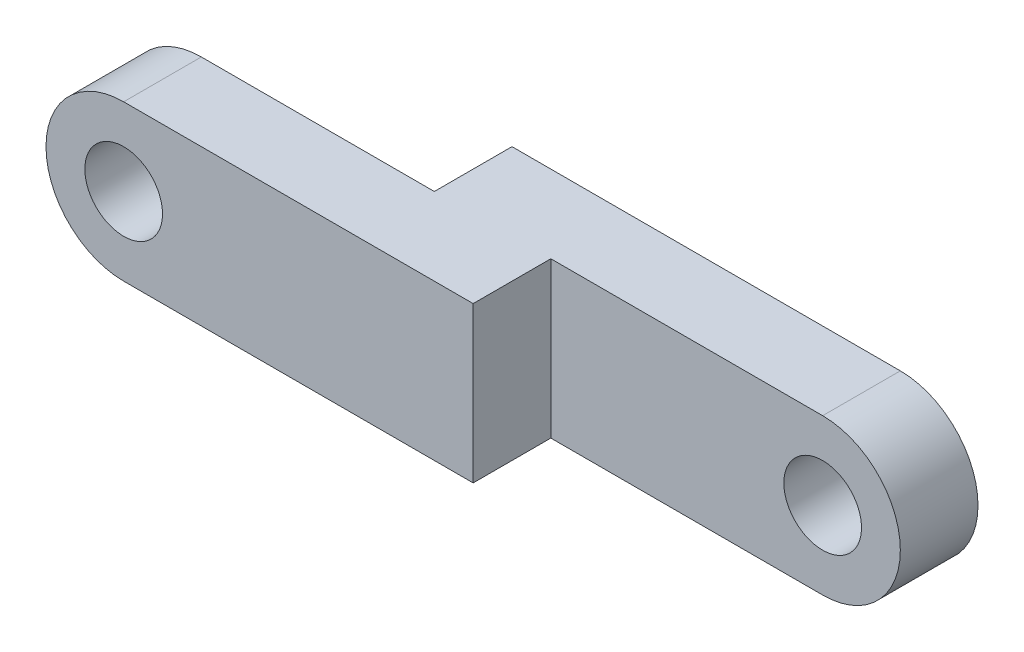
ISO-10303-21;
HEADER;
FILE_DESCRIPTION(('STEP AP214'),'2;1');
FILE_NAME('part.step','',(''),(''),'','','');
FILE_SCHEMA(('AUTOMOTIVE_DESIGN { 1 0 10303 214 1 1 1 1 }'));
ENDSEC;
DATA;
#1=APPLICATION_CONTEXT('core data for automotive mechanical design processes');
#2=APPLICATION_PROTOCOL_DEFINITION('international standard','automotive_design',2000,#1);
#3=PRODUCT_CONTEXT('',#1,'mechanical');
#4=PRODUCT('Part','Part','',(#3));
#5=PRODUCT_RELATED_PRODUCT_CATEGORY('part','',(#4));
#6=PRODUCT_DEFINITION_FORMATION('','',#4);
#7=PRODUCT_DEFINITION_CONTEXT('part definition',#1,'design');
#8=PRODUCT_DEFINITION('design','',#6,#7);
#9=PRODUCT_DEFINITION_SHAPE('','',#8);
#10=(LENGTH_UNIT() NAMED_UNIT(*) SI_UNIT(.MILLI.,.METRE.));
#11=(NAMED_UNIT(*) PLANE_ANGLE_UNIT() SI_UNIT($,.RADIAN.));
#12=(NAMED_UNIT(*) SI_UNIT($,.STERADIAN.) SOLID_ANGLE_UNIT());
#13=UNCERTAINTY_MEASURE_WITH_UNIT(LENGTH_MEASURE(1.E-05),#10,'distance_accuracy_value','');
#14=(GEOMETRIC_REPRESENTATION_CONTEXT(3) GLOBAL_UNCERTAINTY_ASSIGNED_CONTEXT((#13)) GLOBAL_UNIT_ASSIGNED_CONTEXT((#10,
#11,#12)) REPRESENTATION_CONTEXT('',''));
#15=CARTESIAN_POINT('',(0.,0.,0.));
#16=DIRECTION('',(0.,0.,1.));
#17=DIRECTION('',(1.,0.,0.));
#18=AXIS2_PLACEMENT_3D('',#15,#16,#17);
#19=CARTESIAN_POINT('',(-10.16,0.,-1.27));
#20=DIRECTION('',(0.,0.,1.));
#21=DIRECTION('',(1.,0.,0.));
#22=AXIS2_PLACEMENT_3D('',#19,#20,#21);
#23=CYLINDRICAL_SURFACE('',#22,2.54000000000001);
#24=DIRECTION('',(0.,0.,1.));
#25=VECTOR('',#24,1.);
#26=CARTESIAN_POINT('',(-10.16,-2.54000000000001,-1.27));
#27=LINE('',#26,#25);
#28=CARTESIAN_POINT('',(-10.16,-2.54000000000001,-1.27));
#29=VERTEX_POINT('',#28);
#30=CARTESIAN_POINT('',(-10.16,-2.54000000000001,1.27));
#31=VERTEX_POINT('',#30);
#32=EDGE_CURVE('E183',#29,#31,#27,.T.);
#33=ORIENTED_EDGE('',*,*,#32,.T.);
#34=CARTESIAN_POINT('',(-10.16,0.,1.27));
#35=DIRECTION('',(0.,0.,1.));
#36=DIRECTION('',(1.,0.,0.));
#37=AXIS2_PLACEMENT_3D('',#34,#35,#36);
#38=CIRCLE('',#37,2.54000000000001);
#39=CARTESIAN_POINT('',(-10.16,2.54000000000001,1.27));
#40=VERTEX_POINT('',#39);
#41=EDGE_CURVE('E160',#40,#31,#38,.T.);
#42=ORIENTED_EDGE('',*,*,#41,.F.);
#43=DIRECTION('',(0.,0.,1.));
#44=VECTOR('',#43,1.);
#45=CARTESIAN_POINT('',(-10.16,2.54000000000001,-1.27));
#46=LINE('',#45,#44);
#47=CARTESIAN_POINT('',(-10.16,2.54000000000001,-1.27));
#48=VERTEX_POINT('',#47);
#49=EDGE_CURVE('E45',#48,#40,#46,.T.);
#50=ORIENTED_EDGE('',*,*,#49,.F.);
#51=CARTESIAN_POINT('',(-10.16,0.,-1.27));
#52=DIRECTION('',(0.,0.,1.));
#53=DIRECTION('',(1.,0.,0.));
#54=AXIS2_PLACEMENT_3D('',#51,#52,#53);
#55=CIRCLE('',#54,2.54000000000001);
#56=EDGE_CURVE('E174',#48,#29,#55,.T.);
#57=ORIENTED_EDGE('',*,*,#56,.T.);
#58=EDGE_LOOP('',(#33,#42,#50,#57));
#59=FACE_BOUND('',#58,.T.);
#60=ADVANCED_FACE('F37',(#59),#23,.T.);
#61=CARTESIAN_POINT('',(-10.16,2.54000000000001,-1.27));
#62=DIRECTION('',(0.,1.,0.));
#63=DIRECTION('',(-1.,0.,0.));
#64=AXIS2_PLACEMENT_3D('',#61,#62,#63);
#65=PLANE('',#64);
#66=DIRECTION('',(-1.,0.,0.));
#67=VECTOR('',#66,1.);
#68=CARTESIAN_POINT('',(1.27,2.54000000000001,-1.27));
#69=LINE('',#68,#67);
#70=CARTESIAN_POINT('',(10.16,2.54000000000001,-1.27));
#71=VERTEX_POINT('',#70);
#72=CARTESIAN_POINT('',(1.27,2.54000000000001,-1.27));
#73=VERTEX_POINT('',#72);
#74=EDGE_CURVE('E111',#71,#73,#69,.T.);
#75=ORIENTED_EDGE('',*,*,#74,.F.);
#76=DIRECTION('',(0.,0.,1.));
#77=VECTOR('',#76,1.);
#78=CARTESIAN_POINT('',(10.16,2.54000000000001,-1.27));
#79=LINE('',#78,#77);
#80=CARTESIAN_POINT('',(10.16,2.54000000000001,-3.81));
#81=VERTEX_POINT('',#80);
#82=EDGE_CURVE('E187',#81,#71,#79,.T.);
#83=ORIENTED_EDGE('',*,*,#82,.F.);
#84=DIRECTION('',(1.,0.,0.));
#85=VECTOR('',#84,1.);
#86=CARTESIAN_POINT('',(0.,2.54000000000001,-3.81));
#87=LINE('',#86,#85);
#88=CARTESIAN_POINT('',(-2.54,2.54000000000001,-3.81));
#89=VERTEX_POINT('',#88);
#90=EDGE_CURVE('E131',#89,#81,#87,.T.);
#91=ORIENTED_EDGE('',*,*,#90,.F.);
#92=DIRECTION('',(0.,0.,1.));
#93=VECTOR('',#92,1.);
#94=CARTESIAN_POINT('',(-2.54,2.54000000000001,-3.81));
#95=LINE('',#94,#93);
#96=CARTESIAN_POINT('',(-2.54,2.54000000000001,-1.27));
#97=VERTEX_POINT('',#96);
#98=EDGE_CURVE('E153',#89,#97,#95,.T.);
#99=ORIENTED_EDGE('',*,*,#98,.T.);
#100=DIRECTION('',(-1.,0.,0.));
#101=VECTOR('',#100,1.);
#102=CARTESIAN_POINT('',(-10.16,2.54000000000001,-1.27));
#103=LINE('',#102,#101);
#104=EDGE_CURVE('E181',#97,#48,#103,.T.);
#105=ORIENTED_EDGE('',*,*,#104,.T.);
#106=ORIENTED_EDGE('',*,*,#49,.T.);
#107=DIRECTION('',(-1.,0.,0.));
#108=VECTOR('',#107,1.);
#109=CARTESIAN_POINT('',(-10.16,2.54000000000001,1.27));
#110=LINE('',#109,#108);
#111=CARTESIAN_POINT('',(1.27,2.54000000000001,1.27));
#112=VERTEX_POINT('',#111);
#113=EDGE_CURVE('E121',#112,#40,#110,.T.);
#114=ORIENTED_EDGE('',*,*,#113,.F.);
#115=DIRECTION('',(0.,0.,1.));
#116=VECTOR('',#115,1.);
#117=CARTESIAN_POINT('',(1.27,2.54000000000001,-1.27));
#118=LINE('',#117,#116);
#119=EDGE_CURVE('E51',#73,#112,#118,.T.);
#120=ORIENTED_EDGE('',*,*,#119,.F.);
#121=EDGE_LOOP('',(#75,#83,#91,#99,#105,#106,#114,#120));
#122=FACE_BOUND('',#121,.T.);
#123=ADVANCED_FACE('F119',(#122),#65,.T.);
#124=CARTESIAN_POINT('',(10.16,0.,-1.27));
#125=DIRECTION('',(0.,0.,1.));
#126=DIRECTION('',(1.,0.,0.));
#127=AXIS2_PLACEMENT_3D('',#124,#125,#126);
#128=CYLINDRICAL_SURFACE('',#127,2.54000000000001);
#129=CARTESIAN_POINT('',(10.16,0.,-1.27));
#130=DIRECTION('',(0.,0.,-1.));
#131=DIRECTION('',(-1.,0.,0.));
#132=AXIS2_PLACEMENT_3D('',#129,#130,#131);
#133=CIRCLE('',#132,2.54000000000001);
#134=CARTESIAN_POINT('',(10.16,-2.54000000000001,-1.27));
#135=VERTEX_POINT('',#134);
#136=EDGE_CURVE('E114',#135,#71,#133,.F.);
#137=ORIENTED_EDGE('',*,*,#136,.F.);
#138=DIRECTION('',(0.,0.,1.));
#139=VECTOR('',#138,1.);
#140=CARTESIAN_POINT('',(10.16,-2.54,-1.27));
#141=LINE('',#140,#139);
#142=CARTESIAN_POINT('',(10.16,-2.54000000000001,-3.81));
#143=VERTEX_POINT('',#142);
#144=EDGE_CURVE('E185',#143,#135,#141,.T.);
#145=ORIENTED_EDGE('',*,*,#144,.F.);
#146=CARTESIAN_POINT('',(10.16,0.,-3.81));
#147=DIRECTION('',(0.,0.,-1.));
#148=DIRECTION('',(-1.,0.,0.));
#149=AXIS2_PLACEMENT_3D('',#146,#147,#148);
#150=CIRCLE('',#149,2.54000000000001);
#151=EDGE_CURVE('E134',#81,#143,#150,.T.);
#152=ORIENTED_EDGE('',*,*,#151,.F.);
#153=ORIENTED_EDGE('',*,*,#82,.T.);
#154=EDGE_LOOP('',(#137,#145,#152,#153));
#155=FACE_BOUND('',#154,.T.);
#156=ADVANCED_FACE('F218',(#155),#128,.T.);
#157=CARTESIAN_POINT('',(-10.16,-2.54000000000001,-1.27));
#158=DIRECTION('',(0.,-1.,0.));
#159=DIRECTION('',(0.,0.,-1.));
#160=AXIS2_PLACEMENT_3D('',#157,#158,#159);
#161=PLANE('',#160);
#162=DIRECTION('',(1.,0.,0.));
#163=VECTOR('',#162,1.);
#164=CARTESIAN_POINT('',(-10.16,-2.54000000000001,-1.27));
#165=LINE('',#164,#163);
#166=CARTESIAN_POINT('',(1.27,-2.54000000000001,-1.27));
#167=VERTEX_POINT('',#166);
#168=EDGE_CURVE('E125',#167,#135,#165,.T.);
#169=ORIENTED_EDGE('',*,*,#168,.F.);
#170=DIRECTION('',(0.,0.,-1.));
#171=VECTOR('',#170,1.);
#172=CARTESIAN_POINT('',(1.27,-2.54000000000001,-1.27));
#173=LINE('',#172,#171);
#174=CARTESIAN_POINT('',(1.27,-2.54000000000001,1.27));
#175=VERTEX_POINT('',#174);
#176=EDGE_CURVE('E105',#175,#167,#173,.T.);
#177=ORIENTED_EDGE('',*,*,#176,.F.);
#178=DIRECTION('',(1.,0.,0.));
#179=VECTOR('',#178,1.);
#180=CARTESIAN_POINT('',(-10.16,-2.54000000000001,1.27));
#181=LINE('',#180,#179);
#182=EDGE_CURVE('E164',#31,#175,#181,.T.);
#183=ORIENTED_EDGE('',*,*,#182,.F.);
#184=ORIENTED_EDGE('',*,*,#32,.F.);
#185=DIRECTION('',(1.,0.,0.));
#186=VECTOR('',#185,1.);
#187=CARTESIAN_POINT('',(-10.16,-2.54000000000001,-1.27));
#188=LINE('',#187,#186);
#189=CARTESIAN_POINT('',(-2.54,-2.54000000000001,-1.27));
#190=VERTEX_POINT('',#189);
#191=EDGE_CURVE('E149',#29,#190,#188,.T.);
#192=ORIENTED_EDGE('',*,*,#191,.T.);
#193=DIRECTION('',(0.,0.,1.));
#194=VECTOR('',#193,1.);
#195=CARTESIAN_POINT('',(-2.54,-2.54000000000001,-3.81));
#196=LINE('',#195,#194);
#197=CARTESIAN_POINT('',(-2.54,-2.54000000000001,-3.81));
#198=VERTEX_POINT('',#197);
#199=EDGE_CURVE('E59',#198,#190,#196,.T.);
#200=ORIENTED_EDGE('',*,*,#199,.F.);
#201=DIRECTION('',(-1.,0.,0.));
#202=VECTOR('',#201,1.);
#203=CARTESIAN_POINT('',(0.,-2.54000000000001,-3.81));
#204=LINE('',#203,#202);
#205=EDGE_CURVE('E137',#143,#198,#204,.T.);
#206=ORIENTED_EDGE('',*,*,#205,.F.);
#207=ORIENTED_EDGE('',*,*,#144,.T.);
#208=EDGE_LOOP('',(#169,#177,#183,#184,#192,#200,#206,#207));
#209=FACE_BOUND('',#208,.T.);
#210=ADVANCED_FACE('F198',(#209),#161,.T.);
#211=CARTESIAN_POINT('',(-10.16,0.,-1.27));
#212=DIRECTION('',(0.,0.,1.));
#213=DIRECTION('',(1.,0.,0.));
#214=AXIS2_PLACEMENT_3D('',#211,#212,#213);
#215=PLANE('',#214);
#216=CARTESIAN_POINT('',(-10.16,0.,-1.27));
#217=DIRECTION('',(0.,0.,1.));
#218=DIRECTION('',(1.,0.,0.));
#219=AXIS2_PLACEMENT_3D('',#216,#217,#218);
#220=CIRCLE('',#219,1.27);
#221=CARTESIAN_POINT('',(-8.89,0.,-1.27));
#222=VERTEX_POINT('',#221);
#223=EDGE_CURVE('E171',#222,#222,#220,.T.);
#224=ORIENTED_EDGE('',*,*,#223,.T.);
#225=EDGE_LOOP('',(#224));
#226=FACE_BOUND('',#225,.T.);
#227=ORIENTED_EDGE('',*,*,#104,.F.);
#228=DIRECTION('',(0.,-1.,0.));
#229=VECTOR('',#228,1.);
#230=CARTESIAN_POINT('',(-2.54,0.,-1.27));
#231=LINE('',#230,#229);
#232=EDGE_CURVE('E128',#97,#190,#231,.T.);
#233=ORIENTED_EDGE('',*,*,#232,.T.);
#234=ORIENTED_EDGE('',*,*,#191,.F.);
#235=ORIENTED_EDGE('',*,*,#56,.F.);
#236=EDGE_LOOP('',(#227,#233,#234,#235));
#237=FACE_BOUND('',#236,.T.);
#238=ADVANCED_FACE('F225',(#226,#237),#215,.F.);
#239=CARTESIAN_POINT('',(-10.16,0.,-1.27));
#240=DIRECTION('',(0.,0.,1.));
#241=DIRECTION('',(1.,0.,0.));
#242=AXIS2_PLACEMENT_3D('',#239,#240,#241);
#243=CYLINDRICAL_SURFACE('',#242,1.27);
#244=ORIENTED_EDGE('',*,*,#223,.F.);
#245=EDGE_LOOP('',(#244));
#246=FACE_BOUND('',#245,.T.);
#247=CARTESIAN_POINT('',(-10.16,0.,1.27));
#248=DIRECTION('',(0.,0.,1.));
#249=DIRECTION('',(1.,0.,0.));
#250=AXIS2_PLACEMENT_3D('',#247,#248,#249);
#251=CIRCLE('',#250,1.27);
#252=CARTESIAN_POINT('',(-8.89,0.,1.27));
#253=VERTEX_POINT('',#252);
#254=EDGE_CURVE('E144',#253,#253,#251,.T.);
#255=ORIENTED_EDGE('',*,*,#254,.T.);
#256=EDGE_LOOP('',(#255));
#257=FACE_BOUND('',#256,.T.);
#258=ADVANCED_FACE('F211',(#246,#257),#243,.F.);
#259=CARTESIAN_POINT('',(10.16,0.,-1.27));
#260=DIRECTION('',(0.,0.,1.));
#261=DIRECTION('',(1.,0.,0.));
#262=AXIS2_PLACEMENT_3D('',#259,#260,#261);
#263=CYLINDRICAL_SURFACE('',#262,1.27);
#264=CARTESIAN_POINT('',(10.16,0.,-1.27));
#265=DIRECTION('',(0.,0.,-1.));
#266=DIRECTION('',(-1.,0.,0.));
#267=AXIS2_PLACEMENT_3D('',#264,#265,#266);
#268=CIRCLE('',#267,1.27);
#269=CARTESIAN_POINT('',(8.89,0.,-1.27));
#270=VERTEX_POINT('',#269);
#271=EDGE_CURVE('E40',#270,#270,#268,.F.);
#272=ORIENTED_EDGE('',*,*,#271,.T.);
#273=EDGE_LOOP('',(#272));
#274=FACE_BOUND('',#273,.T.);
#275=CARTESIAN_POINT('',(10.16,0.,-3.81));
#276=DIRECTION('',(0.,0.,-1.));
#277=DIRECTION('',(-1.,0.,0.));
#278=AXIS2_PLACEMENT_3D('',#275,#276,#277);
#279=CIRCLE('',#278,1.27);
#280=CARTESIAN_POINT('',(8.89,0.,-3.81));
#281=VERTEX_POINT('',#280);
#282=EDGE_CURVE('E139',#281,#281,#279,.F.);
#283=ORIENTED_EDGE('',*,*,#282,.F.);
#284=EDGE_LOOP('',(#283));
#285=FACE_BOUND('',#284,.T.);
#286=ADVANCED_FACE('F203',(#274,#285),#263,.F.);
#287=CARTESIAN_POINT('',(-10.16,0.,1.27));
#288=DIRECTION('',(0.,0.,1.));
#289=DIRECTION('',(1.,0.,0.));
#290=AXIS2_PLACEMENT_3D('',#287,#288,#289);
#291=PLANE('',#290);
#292=DIRECTION('',(0.,-1.,0.));
#293=VECTOR('',#292,1.);
#294=CARTESIAN_POINT('',(1.27,0.,1.27));
#295=LINE('',#294,#293);
#296=EDGE_CURVE('E11',#112,#175,#295,.T.);
#297=ORIENTED_EDGE('',*,*,#296,.F.);
#298=ORIENTED_EDGE('',*,*,#113,.T.);
#299=ORIENTED_EDGE('',*,*,#41,.T.);
#300=ORIENTED_EDGE('',*,*,#182,.T.);
#301=EDGE_LOOP('',(#297,#298,#299,#300));
#302=FACE_BOUND('',#301,.T.);
#303=ORIENTED_EDGE('',*,*,#254,.F.);
#304=EDGE_LOOP('',(#303));
#305=FACE_BOUND('',#304,.T.);
#306=ADVANCED_FACE('F199',(#302,#305),#291,.T.);
#307=CARTESIAN_POINT('',(-2.54,0.,-3.81));
#308=DIRECTION('',(-1.,0.,0.));
#309=DIRECTION('',(0.,0.,1.));
#310=AXIS2_PLACEMENT_3D('',#307,#308,#309);
#311=PLANE('',#310);
#312=ORIENTED_EDGE('',*,*,#232,.F.);
#313=ORIENTED_EDGE('',*,*,#98,.F.);
#314=DIRECTION('',(0.,-1.,0.));
#315=VECTOR('',#314,1.);
#316=CARTESIAN_POINT('',(-2.54,0.,-3.81));
#317=LINE('',#316,#315);
#318=EDGE_CURVE('E129',#89,#198,#317,.T.);
#319=ORIENTED_EDGE('',*,*,#318,.T.);
#320=ORIENTED_EDGE('',*,*,#199,.T.);
#321=EDGE_LOOP('',(#312,#313,#319,#320));
#322=FACE_BOUND('',#321,.T.);
#323=ADVANCED_FACE('F202',(#322),#311,.T.);
#324=CARTESIAN_POINT('',(0.,0.,-3.81));
#325=DIRECTION('',(0.,0.,-1.));
#326=DIRECTION('',(-1.,0.,0.));
#327=AXIS2_PLACEMENT_3D('',#324,#325,#326);
#328=PLANE('',#327);
#329=ORIENTED_EDGE('',*,*,#318,.F.);
#330=ORIENTED_EDGE('',*,*,#90,.T.);
#331=ORIENTED_EDGE('',*,*,#151,.T.);
#332=ORIENTED_EDGE('',*,*,#205,.T.);
#333=EDGE_LOOP('',(#329,#330,#331,#332));
#334=FACE_BOUND('',#333,.T.);
#335=ORIENTED_EDGE('',*,*,#282,.T.);
#336=EDGE_LOOP('',(#335));
#337=FACE_BOUND('',#336,.T.);
#338=ADVANCED_FACE('F209',(#334,#337),#328,.T.);
#339=CARTESIAN_POINT('',(1.27,-2.54005000000001,-1.27));
#340=DIRECTION('',(0.,0.,-1.));
#341=DIRECTION('',(-1.,0.,0.));
#342=AXIS2_PLACEMENT_3D('',#339,#340,#341);
#343=PLANE('',#342);
#344=ORIENTED_EDGE('',*,*,#136,.T.);
#345=ORIENTED_EDGE('',*,*,#74,.T.);
#346=DIRECTION('',(0.,1.,0.));
#347=VECTOR('',#346,1.);
#348=CARTESIAN_POINT('',(1.27,-2.54005000000001,-1.27));
#349=LINE('',#348,#347);
#350=EDGE_CURVE('E101',#167,#73,#349,.T.);
#351=ORIENTED_EDGE('',*,*,#350,.F.);
#352=ORIENTED_EDGE('',*,*,#168,.T.);
#353=EDGE_LOOP('',(#344,#345,#351,#352));
#354=FACE_BOUND('',#353,.T.);
#355=ORIENTED_EDGE('',*,*,#271,.F.);
#356=EDGE_LOOP('',(#355));
#357=FACE_BOUND('',#356,.T.);
#358=ADVANCED_FACE('F112',(#354,#357),#343,.F.);
#359=CARTESIAN_POINT('',(1.27,-2.54005000000001,-1.27));
#360=DIRECTION('',(-1.,0.,0.));
#361=DIRECTION('',(0.,0.,1.));
#362=AXIS2_PLACEMENT_3D('',#359,#360,#361);
#363=PLANE('',#362);
#364=ORIENTED_EDGE('',*,*,#176,.T.);
#365=ORIENTED_EDGE('',*,*,#350,.T.);
#366=ORIENTED_EDGE('',*,*,#119,.T.);
#367=ORIENTED_EDGE('',*,*,#296,.T.);
#368=EDGE_LOOP('',(#364,#365,#366,#367));
#369=FACE_BOUND('',#368,.T.);
#370=ADVANCED_FACE('F103',(#369),#363,.F.);
#371=CLOSED_SHELL('',(#60,#123,#156,#210,#238,#258,#286,#306,#323,#338,#358,#370));
#372=MANIFOLD_SOLID_BREP('B2',#371);
#373=ADVANCED_BREP_SHAPE_REPRESENTATION('',(#18,#372),#14);
#374=SHAPE_DEFINITION_REPRESENTATION(#9,#373);
ENDSEC;
END-ISO-10303-21;
